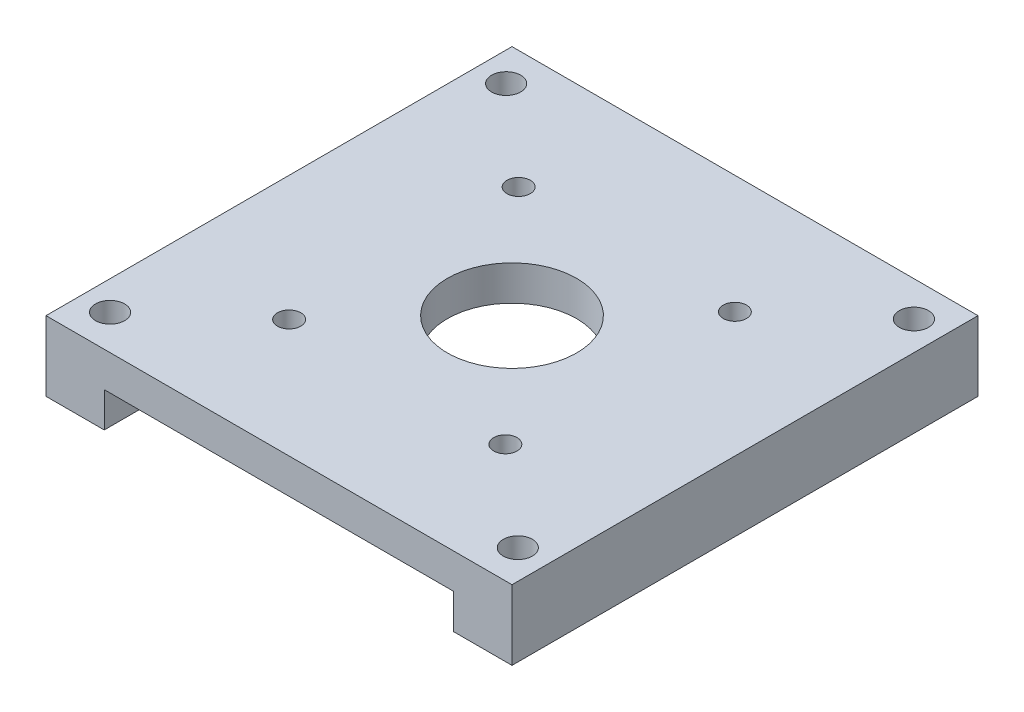
ISO-10303-21;
HEADER;
FILE_DESCRIPTION(('STEP AP214'),'2;1');
FILE_NAME('part.step','',(''),(''),'','','');
FILE_SCHEMA(('AUTOMOTIVE_DESIGN { 1 0 10303 214 1 1 1 1 }'));
ENDSEC;
DATA;
#1=APPLICATION_CONTEXT('core data for automotive mechanical design processes');
#2=APPLICATION_PROTOCOL_DEFINITION('international standard','automotive_design',2000,#1);
#3=PRODUCT_CONTEXT('',#1,'mechanical');
#4=PRODUCT('Part','Part','',(#3));
#5=PRODUCT_RELATED_PRODUCT_CATEGORY('part','',(#4));
#6=PRODUCT_DEFINITION_FORMATION('','',#4);
#7=PRODUCT_DEFINITION_CONTEXT('part definition',#1,'design');
#8=PRODUCT_DEFINITION('design','',#6,#7);
#9=PRODUCT_DEFINITION_SHAPE('','',#8);
#10=(LENGTH_UNIT() NAMED_UNIT(*) SI_UNIT(.MILLI.,.METRE.));
#11=(NAMED_UNIT(*) PLANE_ANGLE_UNIT() SI_UNIT($,.RADIAN.));
#12=(NAMED_UNIT(*) SI_UNIT($,.STERADIAN.) SOLID_ANGLE_UNIT());
#13=UNCERTAINTY_MEASURE_WITH_UNIT(LENGTH_MEASURE(1.E-05),#10,'distance_accuracy_value','');
#14=(GEOMETRIC_REPRESENTATION_CONTEXT(3) GLOBAL_UNCERTAINTY_ASSIGNED_CONTEXT((#13)) GLOBAL_UNIT_ASSIGNED_CONTEXT((#10,
#11,#12)) REPRESENTATION_CONTEXT('',''));
#15=CARTESIAN_POINT('',(0.,0.,0.));
#16=DIRECTION('',(0.,0.,1.));
#17=DIRECTION('',(1.,0.,0.));
#18=AXIS2_PLACEMENT_3D('',#15,#16,#17);
#19=CARTESIAN_POINT('',(0.,0.,0.));
#20=DIRECTION('',(0.,1.,0.));
#21=DIRECTION('',(0.,0.,1.));
#22=AXIS2_PLACEMENT_3D('',#19,#20,#21);
#23=PLANE('',#22);
#24=CARTESIAN_POINT('',(74.3712000000001,0.,-75.819));
#25=DIRECTION('',(0.,1.,0.));
#26=DIRECTION('',(0.,0.,1.));
#27=AXIS2_PLACEMENT_3D('',#24,#25,#26);
#28=CIRCLE('',#27,2.53999999999999);
#29=CARTESIAN_POINT('',(74.3712000000001,0.,-78.359));
#30=VERTEX_POINT('',#29);
#31=EDGE_CURVE('E164',#30,#30,#28,.T.);
#32=ORIENTED_EDGE('',*,*,#31,.T.);
#33=EDGE_LOOP('',(#32));
#34=FACE_BOUND('',#33,.T.);
#35=CARTESIAN_POINT('',(74.3712000000001,0.,-25.7810000000001));
#36=DIRECTION('',(0.,1.,0.));
#37=DIRECTION('',(0.,0.,1.));
#38=AXIS2_PLACEMENT_3D('',#35,#36,#37);
#39=CIRCLE('',#38,2.54);
#40=CARTESIAN_POINT('',(74.3712000000001,0.,-28.3210000000001));
#41=VERTEX_POINT('',#40);
#42=EDGE_CURVE('E198',#41,#41,#39,.T.);
#43=ORIENTED_EDGE('',*,*,#42,.T.);
#44=EDGE_LOOP('',(#43));
#45=FACE_BOUND('',#44,.T.);
#46=CARTESIAN_POINT('',(27.2288000000001,0.,-75.819));
#47=DIRECTION('',(0.,1.,0.));
#48=DIRECTION('',(0.,0.,1.));
#49=AXIS2_PLACEMENT_3D('',#46,#47,#48);
#50=CIRCLE('',#49,2.54);
#51=CARTESIAN_POINT('',(27.2288000000001,0.,-78.359));
#52=VERTEX_POINT('',#51);
#53=EDGE_CURVE('E195',#52,#52,#50,.T.);
#54=ORIENTED_EDGE('',*,*,#53,.T.);
#55=EDGE_LOOP('',(#54));
#56=FACE_BOUND('',#55,.T.);
#57=CARTESIAN_POINT('',(27.2288000000001,0.,-25.7810000000001));
#58=DIRECTION('',(0.,1.,0.));
#59=DIRECTION('',(0.,0.,1.));
#60=AXIS2_PLACEMENT_3D('',#57,#58,#59);
#61=CIRCLE('',#60,2.54);
#62=CARTESIAN_POINT('',(27.2288000000001,0.,-28.3210000000001));
#63=VERTEX_POINT('',#62);
#64=EDGE_CURVE('E192',#63,#63,#61,.T.);
#65=ORIENTED_EDGE('',*,*,#64,.T.);
#66=EDGE_LOOP('',(#65));
#67=FACE_BOUND('',#66,.T.);
#68=CARTESIAN_POINT('',(50.8,0.,-50.8000000000002));
#69=DIRECTION('',(0.,1.,0.));
#70=DIRECTION('',(0.,0.,1.));
#71=AXIS2_PLACEMENT_3D('',#68,#69,#70);
#72=CIRCLE('',#71,14.097);
#73=CARTESIAN_POINT('',(50.8,0.,-64.8970000000002));
#74=VERTEX_POINT('',#73);
#75=EDGE_CURVE('E189',#74,#74,#72,.T.);
#76=ORIENTED_EDGE('',*,*,#75,.T.);
#77=EDGE_LOOP('',(#76));
#78=FACE_BOUND('',#77,.T.);
#79=DIRECTION('',(1.,0.,0.));
#80=VECTOR('',#79,1.);
#81=CARTESIAN_POINT('',(0.,0.,-101.6));
#82=LINE('',#81,#80);
#83=CARTESIAN_POINT('',(12.7,0.,-101.6));
#84=VERTEX_POINT('',#83);
#85=CARTESIAN_POINT('',(88.9,0.,-101.6));
#86=VERTEX_POINT('',#85);
#87=EDGE_CURVE('E67',#84,#86,#82,.T.);
#88=ORIENTED_EDGE('',*,*,#87,.T.);
#89=DIRECTION('',(0.,0.,1.));
#90=VECTOR('',#89,1.);
#91=CARTESIAN_POINT('',(88.9,0.,0.));
#92=LINE('',#91,#90);
#93=CARTESIAN_POINT('',(88.9,0.,0.));
#94=VERTEX_POINT('',#93);
#95=EDGE_CURVE('E62',#86,#94,#92,.T.);
#96=ORIENTED_EDGE('',*,*,#95,.T.);
#97=DIRECTION('',(1.,0.,0.));
#98=VECTOR('',#97,1.);
#99=CARTESIAN_POINT('',(0.,0.,0.));
#100=LINE('',#99,#98);
#101=CARTESIAN_POINT('',(12.7,0.,0.));
#102=VERTEX_POINT('',#101);
#103=EDGE_CURVE('E157',#102,#94,#100,.T.);
#104=ORIENTED_EDGE('',*,*,#103,.F.);
#105=DIRECTION('',(0.,0.,1.));
#106=VECTOR('',#105,1.);
#107=CARTESIAN_POINT('',(12.7,0.,0.));
#108=LINE('',#107,#106);
#109=EDGE_CURVE('E139',#84,#102,#108,.T.);
#110=ORIENTED_EDGE('',*,*,#109,.F.);
#111=EDGE_LOOP('',(#88,#96,#104,#110));
#112=FACE_BOUND('',#111,.T.);
#113=ADVANCED_FACE('F47',(#34,#45,#56,#67,#78,#112),#23,.F.);
#114=CARTESIAN_POINT('',(0.,7.62,0.));
#115=DIRECTION('',(0.,0.,-1.));
#116=DIRECTION('',(-1.,0.,0.));
#117=AXIS2_PLACEMENT_3D('',#114,#115,#116);
#118=PLANE('',#117);
#119=DIRECTION('',(0.,-1.,0.));
#120=VECTOR('',#119,1.);
#121=CARTESIAN_POINT('',(0.,7.62,0.));
#122=LINE('',#121,#120);
#123=CARTESIAN_POINT('',(0.,7.62,0.));
#124=VERTEX_POINT('',#123);
#125=CARTESIAN_POINT('',(0.,-7.62,0.));
#126=VERTEX_POINT('',#125);
#127=EDGE_CURVE('E186',#124,#126,#122,.T.);
#128=ORIENTED_EDGE('',*,*,#127,.T.);
#129=DIRECTION('',(1.,0.,0.));
#130=VECTOR('',#129,1.);
#131=CARTESIAN_POINT('',(0.,-7.62,0.));
#132=LINE('',#131,#130);
#133=CARTESIAN_POINT('',(12.7,-7.62,0.));
#134=VERTEX_POINT('',#133);
#135=EDGE_CURVE('E148',#126,#134,#132,.T.);
#136=ORIENTED_EDGE('',*,*,#135,.T.);
#137=DIRECTION('',(0.,1.,0.));
#138=VECTOR('',#137,1.);
#139=CARTESIAN_POINT('',(12.7,-7.62,0.));
#140=LINE('',#139,#138);
#141=EDGE_CURVE('E154',#134,#102,#140,.T.);
#142=ORIENTED_EDGE('',*,*,#141,.T.);
#143=ORIENTED_EDGE('',*,*,#103,.T.);
#144=DIRECTION('',(0.,1.,0.));
#145=VECTOR('',#144,1.);
#146=CARTESIAN_POINT('',(88.9,-7.62,0.));
#147=LINE('',#146,#145);
#148=CARTESIAN_POINT('',(88.9,-7.62,0.));
#149=VERTEX_POINT('',#148);
#150=EDGE_CURVE('E116',#149,#94,#147,.T.);
#151=ORIENTED_EDGE('',*,*,#150,.F.);
#152=DIRECTION('',(1.,0.,0.));
#153=VECTOR('',#152,1.);
#154=CARTESIAN_POINT('',(0.,-7.62,0.));
#155=LINE('',#154,#153);
#156=CARTESIAN_POINT('',(101.6,-7.62,0.));
#157=VERTEX_POINT('',#156);
#158=EDGE_CURVE('E131',#149,#157,#155,.T.);
#159=ORIENTED_EDGE('',*,*,#158,.T.);
#160=DIRECTION('',(0.,-1.,0.));
#161=VECTOR('',#160,1.);
#162=CARTESIAN_POINT('',(101.6,7.62,0.));
#163=LINE('',#162,#161);
#164=CARTESIAN_POINT('',(101.6,7.62,0.));
#165=VERTEX_POINT('',#164);
#166=EDGE_CURVE('E11',#165,#157,#163,.T.);
#167=ORIENTED_EDGE('',*,*,#166,.F.);
#168=DIRECTION('',(1.,0.,0.));
#169=VECTOR('',#168,1.);
#170=CARTESIAN_POINT('',(0.,7.62,0.));
#171=LINE('',#170,#169);
#172=EDGE_CURVE('E160',#124,#165,#171,.T.);
#173=ORIENTED_EDGE('',*,*,#172,.F.);
#174=EDGE_LOOP('',(#128,#136,#142,#143,#151,#159,#167,#173));
#175=FACE_BOUND('',#174,.T.);
#176=ADVANCED_FACE('F49',(#175),#118,.F.);
#177=CARTESIAN_POINT('',(101.6,7.62,0.));
#178=DIRECTION('',(-1.,0.,0.));
#179=DIRECTION('',(0.,0.,1.));
#180=AXIS2_PLACEMENT_3D('',#177,#178,#179);
#181=PLANE('',#180);
#182=ORIENTED_EDGE('',*,*,#166,.T.);
#183=DIRECTION('',(0.,0.,-1.));
#184=VECTOR('',#183,1.);
#185=CARTESIAN_POINT('',(101.6,-7.62,0.));
#186=LINE('',#185,#184);
#187=CARTESIAN_POINT('',(101.6,-7.62,-101.6));
#188=VERTEX_POINT('',#187);
#189=EDGE_CURVE('E117',#157,#188,#186,.T.);
#190=ORIENTED_EDGE('',*,*,#189,.T.);
#191=DIRECTION('',(0.,-1.,0.));
#192=VECTOR('',#191,1.);
#193=CARTESIAN_POINT('',(101.6,7.62,-101.6));
#194=LINE('',#193,#192);
#195=CARTESIAN_POINT('',(101.6,7.62,-101.6));
#196=VERTEX_POINT('',#195);
#197=EDGE_CURVE('E55',#196,#188,#194,.T.);
#198=ORIENTED_EDGE('',*,*,#197,.F.);
#199=DIRECTION('',(0.,0.,-1.));
#200=VECTOR('',#199,1.);
#201=CARTESIAN_POINT('',(101.6,7.62,0.));
#202=LINE('',#201,#200);
#203=EDGE_CURVE('E163',#165,#196,#202,.T.);
#204=ORIENTED_EDGE('',*,*,#203,.F.);
#205=EDGE_LOOP('',(#182,#190,#198,#204));
#206=FACE_BOUND('',#205,.T.);
#207=ADVANCED_FACE('F226',(#206),#181,.F.);
#208=CARTESIAN_POINT('',(0.,7.62,-101.6));
#209=DIRECTION('',(0.,0.,-1.));
#210=DIRECTION('',(-1.,0.,0.));
#211=AXIS2_PLACEMENT_3D('',#208,#209,#210);
#212=PLANE('',#211);
#213=ORIENTED_EDGE('',*,*,#87,.F.);
#214=DIRECTION('',(0.,1.,0.));
#215=VECTOR('',#214,1.);
#216=CARTESIAN_POINT('',(12.7,-7.62,-101.6));
#217=LINE('',#216,#215);
#218=CARTESIAN_POINT('',(12.7,-7.62,-101.6));
#219=VERTEX_POINT('',#218);
#220=EDGE_CURVE('E151',#219,#84,#217,.T.);
#221=ORIENTED_EDGE('',*,*,#220,.F.);
#222=DIRECTION('',(1.,0.,0.));
#223=VECTOR('',#222,1.);
#224=CARTESIAN_POINT('',(0.,-7.62,-101.6));
#225=LINE('',#224,#223);
#226=CARTESIAN_POINT('',(0.,-7.62,-101.6));
#227=VERTEX_POINT('',#226);
#228=EDGE_CURVE('E143',#227,#219,#225,.T.);
#229=ORIENTED_EDGE('',*,*,#228,.F.);
#230=DIRECTION('',(0.,-1.,0.));
#231=VECTOR('',#230,1.);
#232=CARTESIAN_POINT('',(0.,7.62,-101.6));
#233=LINE('',#232,#231);
#234=CARTESIAN_POINT('',(0.,7.62,-101.6));
#235=VERTEX_POINT('',#234);
#236=EDGE_CURVE('E204',#235,#227,#233,.T.);
#237=ORIENTED_EDGE('',*,*,#236,.F.);
#238=DIRECTION('',(1.,0.,0.));
#239=VECTOR('',#238,1.);
#240=CARTESIAN_POINT('',(0.,7.62,-101.6));
#241=LINE('',#240,#239);
#242=EDGE_CURVE('E166',#235,#196,#241,.T.);
#243=ORIENTED_EDGE('',*,*,#242,.T.);
#244=ORIENTED_EDGE('',*,*,#197,.T.);
#245=DIRECTION('',(1.,0.,0.));
#246=VECTOR('',#245,1.);
#247=CARTESIAN_POINT('',(0.,-7.62,-101.6));
#248=LINE('',#247,#246);
#249=CARTESIAN_POINT('',(88.9,-7.62,-101.6));
#250=VERTEX_POINT('',#249);
#251=EDGE_CURVE('E120',#250,#188,#248,.T.);
#252=ORIENTED_EDGE('',*,*,#251,.F.);
#253=DIRECTION('',(0.,1.,0.));
#254=VECTOR('',#253,1.);
#255=CARTESIAN_POINT('',(88.9,-7.62,-101.6));
#256=LINE('',#255,#254);
#257=EDGE_CURVE('E109',#250,#86,#256,.T.);
#258=ORIENTED_EDGE('',*,*,#257,.T.);
#259=EDGE_LOOP('',(#213,#221,#229,#237,#243,#244,#252,#258));
#260=FACE_BOUND('',#259,.T.);
#261=ADVANCED_FACE('F121',(#260),#212,.T.);
#262=CARTESIAN_POINT('',(74.3712000000001,7.62,-25.7810000000001));
#263=DIRECTION('',(0.,-1.,0.));
#264=DIRECTION('',(0.,0.,-1.));
#265=AXIS2_PLACEMENT_3D('',#262,#263,#264);
#266=CYLINDRICAL_SURFACE('',#265,2.54);
#267=CARTESIAN_POINT('',(74.3712000000001,7.62,-25.7810000000001));
#268=DIRECTION('',(0.,1.,0.));
#269=DIRECTION('',(0.,0.,1.));
#270=AXIS2_PLACEMENT_3D('',#267,#268,#269);
#271=CIRCLE('',#270,2.54);
#272=CARTESIAN_POINT('',(74.3712000000001,7.62,-28.3210000000001));
#273=VERTEX_POINT('',#272);
#274=EDGE_CURVE('E180',#273,#273,#271,.T.);
#275=CARTESIAN_POINT('',(74.3712000000001,7.62,-28.3210000000001));
#276=CARTESIAN_POINT('',(74.3712000000001,7.540625,-28.3210000000001));
#277=CARTESIAN_POINT('',(74.3712000000001,7.46125,-28.3210000000001));
#278=CARTESIAN_POINT('',(74.3712000000001,7.3025,-28.3210000000001));
#279=CARTESIAN_POINT('',(74.3712000000001,7.223125,-28.3210000000001));
#280=CARTESIAN_POINT('',(74.3712000000001,7.064375,-28.3210000000001));
#281=CARTESIAN_POINT('',(74.3712000000001,6.985,-28.3210000000001));
#282=CARTESIAN_POINT('',(74.3712000000001,6.82625,-28.3210000000001));
#283=CARTESIAN_POINT('',(74.3712000000001,6.746875,-28.3210000000001));
#284=CARTESIAN_POINT('',(74.3712000000001,6.588125,-28.3210000000001));
#285=CARTESIAN_POINT('',(74.3712000000001,6.50875,-28.3210000000001));
#286=CARTESIAN_POINT('',(74.3712000000001,6.35,-28.3210000000001));
#287=CARTESIAN_POINT('',(74.3712000000001,6.270625,-28.3210000000001));
#288=CARTESIAN_POINT('',(74.3712000000001,6.111875,-28.3210000000001));
#289=CARTESIAN_POINT('',(74.3712000000001,6.0325,-28.3210000000001));
#290=CARTESIAN_POINT('',(74.3712000000001,5.87375,-28.3210000000001));
#291=CARTESIAN_POINT('',(74.3712000000001,5.794375,-28.3210000000001));
#292=CARTESIAN_POINT('',(74.3712000000001,5.635625,-28.3210000000001));
#293=CARTESIAN_POINT('',(74.3712000000001,5.55625,-28.3210000000001));
#294=CARTESIAN_POINT('',(74.3712000000001,5.3975,-28.3210000000001));
#295=CARTESIAN_POINT('',(74.3712000000001,5.318125,-28.3210000000001));
#296=CARTESIAN_POINT('',(74.3712000000001,5.159375,-28.3210000000001));
#297=CARTESIAN_POINT('',(74.3712000000001,5.08,-28.3210000000001));
#298=CARTESIAN_POINT('',(74.3712000000001,4.92125,-28.3210000000001));
#299=CARTESIAN_POINT('',(74.3712000000001,4.841875,-28.3210000000001));
#300=CARTESIAN_POINT('',(74.3712000000001,4.683125,-28.3210000000001));
#301=CARTESIAN_POINT('',(74.3712000000001,4.60375,-28.3210000000001));
#302=CARTESIAN_POINT('',(74.3712000000001,4.445,-28.3210000000001));
#303=CARTESIAN_POINT('',(74.3712000000001,4.365625,-28.3210000000001));
#304=CARTESIAN_POINT('',(74.3712000000001,4.206875,-28.3210000000001));
#305=CARTESIAN_POINT('',(74.3712000000001,4.1275,-28.3210000000001));
#306=CARTESIAN_POINT('',(74.3712000000001,3.96875,-28.3210000000001));
#307=CARTESIAN_POINT('',(74.3712000000001,3.889375,-28.3210000000001));
#308=CARTESIAN_POINT('',(74.3712000000001,3.730625,-28.3210000000001));
#309=CARTESIAN_POINT('',(74.3712000000001,3.65125,-28.3210000000001));
#310=CARTESIAN_POINT('',(74.3712000000001,3.4925,-28.3210000000001));
#311=CARTESIAN_POINT('',(74.3712000000001,3.413125,-28.3210000000001));
#312=CARTESIAN_POINT('',(74.3712000000001,3.254375,-28.3210000000001));
#313=CARTESIAN_POINT('',(74.3712000000001,3.175,-28.3210000000001));
#314=CARTESIAN_POINT('',(74.3712000000001,3.01625,-28.3210000000001));
#315=CARTESIAN_POINT('',(74.3712000000001,2.936875,-28.3210000000001));
#316=CARTESIAN_POINT('',(74.3712000000001,2.778125,-28.3210000000001));
#317=CARTESIAN_POINT('',(74.3712000000001,2.69875,-28.3210000000001));
#318=CARTESIAN_POINT('',(74.3712000000001,2.54,-28.3210000000001));
#319=CARTESIAN_POINT('',(74.3712000000001,2.460625,-28.3210000000001));
#320=CARTESIAN_POINT('',(74.3712000000001,2.301875,-28.3210000000001));
#321=CARTESIAN_POINT('',(74.3712000000001,2.2225,-28.3210000000001));
#322=CARTESIAN_POINT('',(74.3712000000001,2.06375,-28.3210000000001));
#323=CARTESIAN_POINT('',(74.3712000000001,1.984375,-28.3210000000001));
#324=CARTESIAN_POINT('',(74.3712000000001,1.825625,-28.3210000000001));
#325=CARTESIAN_POINT('',(74.3712000000001,1.74625,-28.3210000000001));
#326=CARTESIAN_POINT('',(74.3712000000001,1.5875,-28.3210000000001));
#327=CARTESIAN_POINT('',(74.3712000000001,1.508125,-28.3210000000001));
#328=CARTESIAN_POINT('',(74.3712000000001,1.349375,-28.3210000000001));
#329=CARTESIAN_POINT('',(74.3712000000001,1.27,-28.3210000000001));
#330=CARTESIAN_POINT('',(74.3712000000001,1.11125,-28.3210000000001));
#331=CARTESIAN_POINT('',(74.3712000000001,1.031875,-28.3210000000001));
#332=CARTESIAN_POINT('',(74.3712000000001,0.873125,-28.3210000000001));
#333=CARTESIAN_POINT('',(74.3712000000001,0.79375,-28.3210000000001));
#334=CARTESIAN_POINT('',(74.3712000000001,0.635,-28.3210000000001));
#335=CARTESIAN_POINT('',(74.3712000000001,0.555625,-28.3210000000001));
#336=CARTESIAN_POINT('',(74.3712000000001,0.396875,-28.3210000000001));
#337=CARTESIAN_POINT('',(74.3712000000001,0.3175,-28.3210000000001));
#338=CARTESIAN_POINT('',(74.3712000000001,0.15875,-28.3210000000001));
#339=CARTESIAN_POINT('',(74.3712000000001,0.0793749999999999,-28.3210000000001));
#340=CARTESIAN_POINT('',(74.3712000000001,0.,-28.3210000000001));
#341=B_SPLINE_CURVE_WITH_KNOTS('',3,(#275,#276,#277,#278,#279,#280,#281,#282,#283,#284,#285,
#286,#287,#288,#289,#290,#291,#292,#293,#294,#295,#296,#297,#298,#299,#300,#301,#302,#303,#304,
#305,#306,#307,#308,#309,#310,#311,#312,#313,#314,#315,#316,#317,#318,#319,#320,#321,#322,#323,
#324,#325,#326,#327,#328,#329,#330,#331,#332,#333,#334,#335,#336,#337,#338,#339,#340),
.UNSPECIFIED.,.F.,.F.,(4,2,2,2,2,2,2,2,2,2,2,2,2,2,2,2,2,2,2,2,2,2,2,2,2,2,2,2,2,2,2,2,4),(0.,
0.238125,0.47625,0.714375000000001,0.9525,1.190625,1.42875,1.666875,1.905,2.143125,2.38125,
2.619375,2.8575,3.095625,3.33375,3.571875,3.81,4.048125,4.28625,4.524375,4.7625,5.000625,
5.23875,5.476875,5.715,5.953125,6.19125,6.429375,6.6675,6.905625,7.14375,7.381875,7.62),.UNSPECIFIED.);
#342=EDGE_CURVE('BSEAM241',#273,#41,#341,.T.);
#343=ORIENTED_EDGE('',*,*,#274,.T.);
#344=ORIENTED_EDGE('',*,*,#42,.F.);
#345=ORIENTED_EDGE('',*,*,#342,.T.);
#346=ORIENTED_EDGE('',*,*,#342,.F.);
#347=EDGE_LOOP('',(#343,#345,#344,#346));
#348=FACE_BOUND('',#347,.T.);
#349=ADVANCED_FACE('F241',(#348),#266,.F.);
#350=CARTESIAN_POINT('',(27.2288000000001,7.62,-75.819));
#351=DIRECTION('',(0.,-1.,0.));
#352=DIRECTION('',(0.,0.,-1.));
#353=AXIS2_PLACEMENT_3D('',#350,#351,#352);
#354=CYLINDRICAL_SURFACE('',#353,2.54);
#355=CARTESIAN_POINT('',(27.2288000000001,7.62,-75.819));
#356=DIRECTION('',(0.,1.,0.));
#357=DIRECTION('',(0.,0.,1.));
#358=AXIS2_PLACEMENT_3D('',#355,#356,#357);
#359=CIRCLE('',#358,2.54);
#360=CARTESIAN_POINT('',(27.2288000000001,7.62,-78.359));
#361=VERTEX_POINT('',#360);
#362=EDGE_CURVE('E177',#361,#361,#359,.T.);
#363=CARTESIAN_POINT('',(27.2288000000001,7.62,-78.359));
#364=CARTESIAN_POINT('',(27.2288000000001,7.540625,-78.359));
#365=CARTESIAN_POINT('',(27.2288000000001,7.46125,-78.359));
#366=CARTESIAN_POINT('',(27.2288000000001,7.3025,-78.359));
#367=CARTESIAN_POINT('',(27.2288000000001,7.223125,-78.359));
#368=CARTESIAN_POINT('',(27.2288000000001,7.064375,-78.359));
#369=CARTESIAN_POINT('',(27.2288000000001,6.985,-78.359));
#370=CARTESIAN_POINT('',(27.2288000000001,6.82625,-78.359));
#371=CARTESIAN_POINT('',(27.2288000000001,6.746875,-78.359));
#372=CARTESIAN_POINT('',(27.2288000000001,6.588125,-78.359));
#373=CARTESIAN_POINT('',(27.2288000000001,6.50875,-78.359));
#374=CARTESIAN_POINT('',(27.2288000000001,6.35,-78.359));
#375=CARTESIAN_POINT('',(27.2288000000001,6.270625,-78.359));
#376=CARTESIAN_POINT('',(27.2288000000001,6.111875,-78.359));
#377=CARTESIAN_POINT('',(27.2288000000001,6.0325,-78.359));
#378=CARTESIAN_POINT('',(27.2288000000001,5.87375,-78.359));
#379=CARTESIAN_POINT('',(27.2288000000001,5.794375,-78.359));
#380=CARTESIAN_POINT('',(27.2288000000001,5.635625,-78.359));
#381=CARTESIAN_POINT('',(27.2288000000001,5.55625,-78.359));
#382=CARTESIAN_POINT('',(27.2288000000001,5.3975,-78.359));
#383=CARTESIAN_POINT('',(27.2288000000001,5.318125,-78.359));
#384=CARTESIAN_POINT('',(27.2288000000001,5.159375,-78.359));
#385=CARTESIAN_POINT('',(27.2288000000001,5.08,-78.359));
#386=CARTESIAN_POINT('',(27.2288000000001,4.92125,-78.359));
#387=CARTESIAN_POINT('',(27.2288000000001,4.841875,-78.359));
#388=CARTESIAN_POINT('',(27.2288000000001,4.683125,-78.359));
#389=CARTESIAN_POINT('',(27.2288000000001,4.60375,-78.359));
#390=CARTESIAN_POINT('',(27.2288000000001,4.445,-78.359));
#391=CARTESIAN_POINT('',(27.2288000000001,4.365625,-78.359));
#392=CARTESIAN_POINT('',(27.2288000000001,4.206875,-78.359));
#393=CARTESIAN_POINT('',(27.2288000000001,4.1275,-78.359));
#394=CARTESIAN_POINT('',(27.2288000000001,3.96875,-78.359));
#395=CARTESIAN_POINT('',(27.2288000000001,3.889375,-78.359));
#396=CARTESIAN_POINT('',(27.2288000000001,3.730625,-78.359));
#397=CARTESIAN_POINT('',(27.2288000000001,3.65125,-78.359));
#398=CARTESIAN_POINT('',(27.2288000000001,3.4925,-78.359));
#399=CARTESIAN_POINT('',(27.2288000000001,3.413125,-78.359));
#400=CARTESIAN_POINT('',(27.2288000000001,3.254375,-78.359));
#401=CARTESIAN_POINT('',(27.2288000000001,3.175,-78.359));
#402=CARTESIAN_POINT('',(27.2288000000001,3.01625,-78.359));
#403=CARTESIAN_POINT('',(27.2288000000001,2.936875,-78.359));
#404=CARTESIAN_POINT('',(27.2288000000001,2.778125,-78.359));
#405=CARTESIAN_POINT('',(27.2288000000001,2.69875,-78.359));
#406=CARTESIAN_POINT('',(27.2288000000001,2.54,-78.359));
#407=CARTESIAN_POINT('',(27.2288000000001,2.460625,-78.359));
#408=CARTESIAN_POINT('',(27.2288000000001,2.301875,-78.359));
#409=CARTESIAN_POINT('',(27.2288000000001,2.2225,-78.359));
#410=CARTESIAN_POINT('',(27.2288000000001,2.06375,-78.359));
#411=CARTESIAN_POINT('',(27.2288000000001,1.984375,-78.359));
#412=CARTESIAN_POINT('',(27.2288000000001,1.825625,-78.359));
#413=CARTESIAN_POINT('',(27.2288000000001,1.74625,-78.359));
#414=CARTESIAN_POINT('',(27.2288000000001,1.5875,-78.359));
#415=CARTESIAN_POINT('',(27.2288000000001,1.508125,-78.359));
#416=CARTESIAN_POINT('',(27.2288000000001,1.349375,-78.359));
#417=CARTESIAN_POINT('',(27.2288000000001,1.27,-78.359));
#418=CARTESIAN_POINT('',(27.2288000000001,1.11125,-78.359));
#419=CARTESIAN_POINT('',(27.2288000000001,1.031875,-78.359));
#420=CARTESIAN_POINT('',(27.2288000000001,0.873125,-78.359));
#421=CARTESIAN_POINT('',(27.2288000000001,0.79375,-78.359));
#422=CARTESIAN_POINT('',(27.2288000000001,0.635,-78.359));
#423=CARTESIAN_POINT('',(27.2288000000001,0.555625,-78.359));
#424=CARTESIAN_POINT('',(27.2288000000001,0.396875,-78.359));
#425=CARTESIAN_POINT('',(27.2288000000001,0.3175,-78.359));
#426=CARTESIAN_POINT('',(27.2288000000001,0.15875,-78.359));
#427=CARTESIAN_POINT('',(27.2288000000001,0.0793749999999999,-78.359));
#428=CARTESIAN_POINT('',(27.2288000000001,0.,-78.359));
#429=B_SPLINE_CURVE_WITH_KNOTS('',3,(#363,#364,#365,#366,#367,#368,#369,#370,#371,#372,#373,
#374,#375,#376,#377,#378,#379,#380,#381,#382,#383,#384,#385,#386,#387,#388,#389,#390,#391,#392,
#393,#394,#395,#396,#397,#398,#399,#400,#401,#402,#403,#404,#405,#406,#407,#408,#409,#410,#411,
#412,#413,#414,#415,#416,#417,#418,#419,#420,#421,#422,#423,#424,#425,#426,#427,#428),
.UNSPECIFIED.,.F.,.F.,(4,2,2,2,2,2,2,2,2,2,2,2,2,2,2,2,2,2,2,2,2,2,2,2,2,2,2,2,2,2,2,2,4),(0.,
0.238125,0.47625,0.714375000000001,0.9525,1.190625,1.42875,1.666875,1.905,2.143125,2.38125,
2.619375,2.8575,3.095625,3.33375,3.571875,3.81,4.048125,4.28625,4.524375,4.7625,5.000625,
5.23875,5.476875,5.715,5.953125,6.19125,6.429375,6.6675,6.905625,7.14375,7.381875,7.62),.UNSPECIFIED.);
#430=EDGE_CURVE('BSEAM244',#361,#52,#429,.T.);
#431=ORIENTED_EDGE('',*,*,#362,.T.);
#432=ORIENTED_EDGE('',*,*,#53,.F.);
#433=ORIENTED_EDGE('',*,*,#430,.T.);
#434=ORIENTED_EDGE('',*,*,#430,.F.);
#435=EDGE_LOOP('',(#431,#433,#432,#434));
#436=FACE_BOUND('',#435,.T.);
#437=ADVANCED_FACE('F244',(#436),#354,.F.);
#438=CARTESIAN_POINT('',(27.2288000000001,7.62,-25.7810000000001));
#439=DIRECTION('',(0.,-1.,0.));
#440=DIRECTION('',(0.,0.,-1.));
#441=AXIS2_PLACEMENT_3D('',#438,#439,#440);
#442=CYLINDRICAL_SURFACE('',#441,2.54);
#443=CARTESIAN_POINT('',(27.2288000000001,7.62,-25.7810000000001));
#444=DIRECTION('',(0.,1.,0.));
#445=DIRECTION('',(0.,0.,1.));
#446=AXIS2_PLACEMENT_3D('',#443,#444,#445);
#447=CIRCLE('',#446,2.54);
#448=CARTESIAN_POINT('',(27.2288000000001,7.62,-28.3210000000001));
#449=VERTEX_POINT('',#448);
#450=EDGE_CURVE('E174',#449,#449,#447,.T.);
#451=CARTESIAN_POINT('',(27.2288000000001,7.62,-28.3210000000001));
#452=CARTESIAN_POINT('',(27.2288000000001,7.540625,-28.3210000000001));
#453=CARTESIAN_POINT('',(27.2288000000001,7.46125,-28.3210000000001));
#454=CARTESIAN_POINT('',(27.2288000000001,7.3025,-28.3210000000001));
#455=CARTESIAN_POINT('',(27.2288000000001,7.223125,-28.3210000000001));
#456=CARTESIAN_POINT('',(27.2288000000001,7.064375,-28.3210000000001));
#457=CARTESIAN_POINT('',(27.2288000000001,6.985,-28.3210000000001));
#458=CARTESIAN_POINT('',(27.2288000000001,6.82625,-28.3210000000001));
#459=CARTESIAN_POINT('',(27.2288000000001,6.746875,-28.3210000000001));
#460=CARTESIAN_POINT('',(27.2288000000001,6.588125,-28.3210000000001));
#461=CARTESIAN_POINT('',(27.2288000000001,6.50875,-28.3210000000001));
#462=CARTESIAN_POINT('',(27.2288000000001,6.35,-28.3210000000001));
#463=CARTESIAN_POINT('',(27.2288000000001,6.270625,-28.3210000000001));
#464=CARTESIAN_POINT('',(27.2288000000001,6.111875,-28.3210000000001));
#465=CARTESIAN_POINT('',(27.2288000000001,6.0325,-28.3210000000001));
#466=CARTESIAN_POINT('',(27.2288000000001,5.87375,-28.3210000000001));
#467=CARTESIAN_POINT('',(27.2288000000001,5.794375,-28.3210000000001));
#468=CARTESIAN_POINT('',(27.2288000000001,5.635625,-28.3210000000001));
#469=CARTESIAN_POINT('',(27.2288000000001,5.55625,-28.3210000000001));
#470=CARTESIAN_POINT('',(27.2288000000001,5.3975,-28.3210000000001));
#471=CARTESIAN_POINT('',(27.2288000000001,5.318125,-28.3210000000001));
#472=CARTESIAN_POINT('',(27.2288000000001,5.159375,-28.3210000000001));
#473=CARTESIAN_POINT('',(27.2288000000001,5.08,-28.3210000000001));
#474=CARTESIAN_POINT('',(27.2288000000001,4.92125,-28.3210000000001));
#475=CARTESIAN_POINT('',(27.2288000000001,4.841875,-28.3210000000001));
#476=CARTESIAN_POINT('',(27.2288000000001,4.683125,-28.3210000000001));
#477=CARTESIAN_POINT('',(27.2288000000001,4.60375,-28.3210000000001));
#478=CARTESIAN_POINT('',(27.2288000000001,4.445,-28.3210000000001));
#479=CARTESIAN_POINT('',(27.2288000000001,4.365625,-28.3210000000001));
#480=CARTESIAN_POINT('',(27.2288000000001,4.206875,-28.3210000000001));
#481=CARTESIAN_POINT('',(27.2288000000001,4.1275,-28.3210000000001));
#482=CARTESIAN_POINT('',(27.2288000000001,3.96875,-28.3210000000001));
#483=CARTESIAN_POINT('',(27.2288000000001,3.889375,-28.3210000000001));
#484=CARTESIAN_POINT('',(27.2288000000001,3.730625,-28.3210000000001));
#485=CARTESIAN_POINT('',(27.2288000000001,3.65125,-28.3210000000001));
#486=CARTESIAN_POINT('',(27.2288000000001,3.4925,-28.3210000000001));
#487=CARTESIAN_POINT('',(27.2288000000001,3.413125,-28.3210000000001));
#488=CARTESIAN_POINT('',(27.2288000000001,3.254375,-28.3210000000001));
#489=CARTESIAN_POINT('',(27.2288000000001,3.175,-28.3210000000001));
#490=CARTESIAN_POINT('',(27.2288000000001,3.01625,-28.3210000000001));
#491=CARTESIAN_POINT('',(27.2288000000001,2.936875,-28.3210000000001));
#492=CARTESIAN_POINT('',(27.2288000000001,2.778125,-28.3210000000001));
#493=CARTESIAN_POINT('',(27.2288000000001,2.69875,-28.3210000000001));
#494=CARTESIAN_POINT('',(27.2288000000001,2.54,-28.3210000000001));
#495=CARTESIAN_POINT('',(27.2288000000001,2.460625,-28.3210000000001));
#496=CARTESIAN_POINT('',(27.2288000000001,2.301875,-28.3210000000001));
#497=CARTESIAN_POINT('',(27.2288000000001,2.2225,-28.3210000000001));
#498=CARTESIAN_POINT('',(27.2288000000001,2.06375,-28.3210000000001));
#499=CARTESIAN_POINT('',(27.2288000000001,1.984375,-28.3210000000001));
#500=CARTESIAN_POINT('',(27.2288000000001,1.825625,-28.3210000000001));
#501=CARTESIAN_POINT('',(27.2288000000001,1.74625,-28.3210000000001));
#502=CARTESIAN_POINT('',(27.2288000000001,1.5875,-28.3210000000001));
#503=CARTESIAN_POINT('',(27.2288000000001,1.508125,-28.3210000000001));
#504=CARTESIAN_POINT('',(27.2288000000001,1.349375,-28.3210000000001));
#505=CARTESIAN_POINT('',(27.2288000000001,1.27,-28.3210000000001));
#506=CARTESIAN_POINT('',(27.2288000000001,1.11125,-28.3210000000001));
#507=CARTESIAN_POINT('',(27.2288000000001,1.031875,-28.3210000000001));
#508=CARTESIAN_POINT('',(27.2288000000001,0.873125,-28.3210000000001));
#509=CARTESIAN_POINT('',(27.2288000000001,0.79375,-28.3210000000001));
#510=CARTESIAN_POINT('',(27.2288000000001,0.635,-28.3210000000001));
#511=CARTESIAN_POINT('',(27.2288000000001,0.555625,-28.3210000000001));
#512=CARTESIAN_POINT('',(27.2288000000001,0.396875,-28.3210000000001));
#513=CARTESIAN_POINT('',(27.2288000000001,0.3175,-28.3210000000001));
#514=CARTESIAN_POINT('',(27.2288000000001,0.15875,-28.3210000000001));
#515=CARTESIAN_POINT('',(27.2288000000001,0.0793749999999999,-28.3210000000001));
#516=CARTESIAN_POINT('',(27.2288000000001,0.,-28.3210000000001));
#517=B_SPLINE_CURVE_WITH_KNOTS('',3,(#451,#452,#453,#454,#455,#456,#457,#458,#459,#460,#461,
#462,#463,#464,#465,#466,#467,#468,#469,#470,#471,#472,#473,#474,#475,#476,#477,#478,#479,#480,
#481,#482,#483,#484,#485,#486,#487,#488,#489,#490,#491,#492,#493,#494,#495,#496,#497,#498,#499,
#500,#501,#502,#503,#504,#505,#506,#507,#508,#509,#510,#511,#512,#513,#514,#515,#516),
.UNSPECIFIED.,.F.,.F.,(4,2,2,2,2,2,2,2,2,2,2,2,2,2,2,2,2,2,2,2,2,2,2,2,2,2,2,2,2,2,2,2,4),(0.,
0.238125,0.47625,0.714375000000001,0.9525,1.190625,1.42875,1.666875,1.905,2.143125,2.38125,
2.619375,2.8575,3.095625,3.33375,3.571875,3.81,4.048125,4.28625,4.524375,4.7625,5.000625,
5.23875,5.476875,5.715,5.953125,6.19125,6.429375,6.6675,6.905625,7.14375,7.381875,7.62),.UNSPECIFIED.);
#518=EDGE_CURVE('BSEAM248',#449,#63,#517,.T.);
#519=ORIENTED_EDGE('',*,*,#450,.T.);
#520=ORIENTED_EDGE('',*,*,#64,.F.);
#521=ORIENTED_EDGE('',*,*,#518,.T.);
#522=ORIENTED_EDGE('',*,*,#518,.F.);
#523=EDGE_LOOP('',(#519,#521,#520,#522));
#524=FACE_BOUND('',#523,.T.);
#525=ADVANCED_FACE('F248',(#524),#442,.F.);
#526=CARTESIAN_POINT('',(50.8,7.62,-50.8000000000002));
#527=DIRECTION('',(0.,-1.,0.));
#528=DIRECTION('',(0.,0.,-1.));
#529=AXIS2_PLACEMENT_3D('',#526,#527,#528);
#530=CYLINDRICAL_SURFACE('',#529,14.097);
#531=CARTESIAN_POINT('',(50.8,7.62,-50.8000000000002));
#532=DIRECTION('',(0.,1.,0.));
#533=DIRECTION('',(0.,0.,1.));
#534=AXIS2_PLACEMENT_3D('',#531,#532,#533);
#535=CIRCLE('',#534,14.097);
#536=CARTESIAN_POINT('',(50.8,7.62,-64.8970000000002));
#537=VERTEX_POINT('',#536);
#538=EDGE_CURVE('E171',#537,#537,#535,.T.);
#539=CARTESIAN_POINT('',(50.8,7.62,-64.8970000000002));
#540=CARTESIAN_POINT('',(50.8,7.540625,-64.8970000000002));
#541=CARTESIAN_POINT('',(50.8,7.46125,-64.8970000000002));
#542=CARTESIAN_POINT('',(50.8,7.3025,-64.8970000000002));
#543=CARTESIAN_POINT('',(50.8,7.223125,-64.8970000000002));
#544=CARTESIAN_POINT('',(50.8,7.064375,-64.8970000000002));
#545=CARTESIAN_POINT('',(50.8,6.985,-64.8970000000002));
#546=CARTESIAN_POINT('',(50.8,6.82625,-64.8970000000002));
#547=CARTESIAN_POINT('',(50.8,6.746875,-64.8970000000002));
#548=CARTESIAN_POINT('',(50.8,6.588125,-64.8970000000002));
#549=CARTESIAN_POINT('',(50.8,6.50875,-64.8970000000002));
#550=CARTESIAN_POINT('',(50.8,6.35,-64.8970000000002));
#551=CARTESIAN_POINT('',(50.8,6.270625,-64.8970000000002));
#552=CARTESIAN_POINT('',(50.8,6.111875,-64.8970000000002));
#553=CARTESIAN_POINT('',(50.8,6.0325,-64.8970000000002));
#554=CARTESIAN_POINT('',(50.8,5.87375,-64.8970000000002));
#555=CARTESIAN_POINT('',(50.8,5.794375,-64.8970000000002));
#556=CARTESIAN_POINT('',(50.8,5.635625,-64.8970000000002));
#557=CARTESIAN_POINT('',(50.8,5.55625,-64.8970000000002));
#558=CARTESIAN_POINT('',(50.8,5.3975,-64.8970000000002));
#559=CARTESIAN_POINT('',(50.8,5.318125,-64.8970000000002));
#560=CARTESIAN_POINT('',(50.8,5.159375,-64.8970000000002));
#561=CARTESIAN_POINT('',(50.8,5.08,-64.8970000000002));
#562=CARTESIAN_POINT('',(50.8,4.92125,-64.8970000000002));
#563=CARTESIAN_POINT('',(50.8,4.841875,-64.8970000000002));
#564=CARTESIAN_POINT('',(50.8,4.683125,-64.8970000000002));
#565=CARTESIAN_POINT('',(50.8,4.60375,-64.8970000000002));
#566=CARTESIAN_POINT('',(50.8,4.445,-64.8970000000002));
#567=CARTESIAN_POINT('',(50.8,4.365625,-64.8970000000002));
#568=CARTESIAN_POINT('',(50.8,4.206875,-64.8970000000002));
#569=CARTESIAN_POINT('',(50.8,4.1275,-64.8970000000002));
#570=CARTESIAN_POINT('',(50.8,3.96875,-64.8970000000002));
#571=CARTESIAN_POINT('',(50.8,3.889375,-64.8970000000002));
#572=CARTESIAN_POINT('',(50.8,3.730625,-64.8970000000002));
#573=CARTESIAN_POINT('',(50.8,3.65125,-64.8970000000002));
#574=CARTESIAN_POINT('',(50.8,3.4925,-64.8970000000002));
#575=CARTESIAN_POINT('',(50.8,3.413125,-64.8970000000002));
#576=CARTESIAN_POINT('',(50.8,3.254375,-64.8970000000002));
#577=CARTESIAN_POINT('',(50.8,3.175,-64.8970000000002));
#578=CARTESIAN_POINT('',(50.8,3.01625,-64.8970000000002));
#579=CARTESIAN_POINT('',(50.8,2.936875,-64.8970000000002));
#580=CARTESIAN_POINT('',(50.8,2.778125,-64.8970000000002));
#581=CARTESIAN_POINT('',(50.8,2.69875,-64.8970000000002));
#582=CARTESIAN_POINT('',(50.8,2.54,-64.8970000000002));
#583=CARTESIAN_POINT('',(50.8,2.460625,-64.8970000000002));
#584=CARTESIAN_POINT('',(50.8,2.301875,-64.8970000000002));
#585=CARTESIAN_POINT('',(50.8,2.2225,-64.8970000000002));
#586=CARTESIAN_POINT('',(50.8,2.06375,-64.8970000000002));
#587=CARTESIAN_POINT('',(50.8,1.984375,-64.8970000000002));
#588=CARTESIAN_POINT('',(50.8,1.825625,-64.8970000000002));
#589=CARTESIAN_POINT('',(50.8,1.74625,-64.8970000000002));
#590=CARTESIAN_POINT('',(50.8,1.5875,-64.8970000000002));
#591=CARTESIAN_POINT('',(50.8,1.508125,-64.8970000000002));
#592=CARTESIAN_POINT('',(50.8,1.349375,-64.8970000000002));
#593=CARTESIAN_POINT('',(50.8,1.27,-64.8970000000002));
#594=CARTESIAN_POINT('',(50.8,1.11125,-64.8970000000002));
#595=CARTESIAN_POINT('',(50.8,1.031875,-64.8970000000002));
#596=CARTESIAN_POINT('',(50.8,0.873125,-64.8970000000002));
#597=CARTESIAN_POINT('',(50.8,0.79375,-64.8970000000002));
#598=CARTESIAN_POINT('',(50.8,0.635,-64.8970000000002));
#599=CARTESIAN_POINT('',(50.8,0.555625,-64.8970000000002));
#600=CARTESIAN_POINT('',(50.8,0.396875,-64.8970000000002));
#601=CARTESIAN_POINT('',(50.8,0.3175,-64.8970000000002));
#602=CARTESIAN_POINT('',(50.8,0.15875,-64.8970000000002));
#603=CARTESIAN_POINT('',(50.8,0.0793749999999999,-64.8970000000002));
#604=CARTESIAN_POINT('',(50.8,0.,-64.8970000000002));
#605=B_SPLINE_CURVE_WITH_KNOTS('',3,(#539,#540,#541,#542,#543,#544,#545,#546,#547,#548,#549,
#550,#551,#552,#553,#554,#555,#556,#557,#558,#559,#560,#561,#562,#563,#564,#565,#566,#567,#568,
#569,#570,#571,#572,#573,#574,#575,#576,#577,#578,#579,#580,#581,#582,#583,#584,#585,#586,#587,
#588,#589,#590,#591,#592,#593,#594,#595,#596,#597,#598,#599,#600,#601,#602,#603,#604),
.UNSPECIFIED.,.F.,.F.,(4,2,2,2,2,2,2,2,2,2,2,2,2,2,2,2,2,2,2,2,2,2,2,2,2,2,2,2,2,2,2,2,4),(0.,
0.238125,0.47625,0.714375000000001,0.9525,1.190625,1.42875,1.666875,1.905,2.143125,2.38125,
2.619375,2.8575,3.095625,3.33375,3.571875,3.81,4.048125,4.28625,4.524375,4.7625,5.000625,
5.23875,5.476875,5.715,5.953125,6.19125,6.429375,6.6675,6.905625,7.14375,7.381875,7.62),.UNSPECIFIED.);
#606=EDGE_CURVE('BSEAM252',#537,#74,#605,.T.);
#607=ORIENTED_EDGE('',*,*,#538,.T.);
#608=ORIENTED_EDGE('',*,*,#75,.F.);
#609=ORIENTED_EDGE('',*,*,#606,.T.);
#610=ORIENTED_EDGE('',*,*,#606,.F.);
#611=EDGE_LOOP('',(#607,#609,#608,#610));
#612=FACE_BOUND('',#611,.T.);
#613=ADVANCED_FACE('F252',(#612),#530,.F.);
#614=CARTESIAN_POINT('',(0.,7.62,0.));
#615=DIRECTION('',(-1.,0.,0.));
#616=DIRECTION('',(0.,0.,1.));
#617=AXIS2_PLACEMENT_3D('',#614,#615,#616);
#618=PLANE('',#617);
#619=ORIENTED_EDGE('',*,*,#236,.T.);
#620=DIRECTION('',(0.,0.,-1.));
#621=VECTOR('',#620,1.);
#622=CARTESIAN_POINT('',(0.,-7.62,0.));
#623=LINE('',#622,#621);
#624=EDGE_CURVE('E145',#126,#227,#623,.T.);
#625=ORIENTED_EDGE('',*,*,#624,.F.);
#626=ORIENTED_EDGE('',*,*,#127,.F.);
#627=DIRECTION('',(0.,0.,-1.));
#628=VECTOR('',#627,1.);
#629=CARTESIAN_POINT('',(0.,7.62,0.));
#630=LINE('',#629,#628);
#631=EDGE_CURVE('E168',#124,#235,#630,.T.);
#632=ORIENTED_EDGE('',*,*,#631,.T.);
#633=EDGE_LOOP('',(#619,#625,#626,#632));
#634=FACE_BOUND('',#633,.T.);
#635=ADVANCED_FACE('F207',(#634),#618,.T.);
#636=CARTESIAN_POINT('',(74.3712000000001,7.62,-75.819));
#637=DIRECTION('',(0.,-1.,0.));
#638=DIRECTION('',(0.,0.,-1.));
#639=AXIS2_PLACEMENT_3D('',#636,#637,#638);
#640=CYLINDRICAL_SURFACE('',#639,2.53999999999999);
#641=CARTESIAN_POINT('',(74.3712000000001,7.62,-75.819));
#642=DIRECTION('',(0.,1.,0.));
#643=DIRECTION('',(0.,0.,1.));
#644=AXIS2_PLACEMENT_3D('',#641,#642,#643);
#645=CIRCLE('',#644,2.53999999999999);
#646=CARTESIAN_POINT('',(74.3712000000001,7.62,-78.359));
#647=VERTEX_POINT('',#646);
#648=EDGE_CURVE('E183',#647,#647,#645,.T.);
#649=CARTESIAN_POINT('',(74.3712000000001,7.62,-78.359));
#650=CARTESIAN_POINT('',(74.3712000000001,7.540625,-78.359));
#651=CARTESIAN_POINT('',(74.3712000000001,7.46125,-78.359));
#652=CARTESIAN_POINT('',(74.3712000000001,7.3025,-78.359));
#653=CARTESIAN_POINT('',(74.3712000000001,7.223125,-78.359));
#654=CARTESIAN_POINT('',(74.3712000000001,7.064375,-78.359));
#655=CARTESIAN_POINT('',(74.3712000000001,6.985,-78.359));
#656=CARTESIAN_POINT('',(74.3712000000001,6.82625,-78.359));
#657=CARTESIAN_POINT('',(74.3712000000001,6.746875,-78.359));
#658=CARTESIAN_POINT('',(74.3712000000001,6.588125,-78.359));
#659=CARTESIAN_POINT('',(74.3712000000001,6.50875,-78.359));
#660=CARTESIAN_POINT('',(74.3712000000001,6.35,-78.359));
#661=CARTESIAN_POINT('',(74.3712000000001,6.270625,-78.359));
#662=CARTESIAN_POINT('',(74.3712000000001,6.111875,-78.359));
#663=CARTESIAN_POINT('',(74.3712000000001,6.0325,-78.359));
#664=CARTESIAN_POINT('',(74.3712000000001,5.87375,-78.359));
#665=CARTESIAN_POINT('',(74.3712000000001,5.794375,-78.359));
#666=CARTESIAN_POINT('',(74.3712000000001,5.635625,-78.359));
#667=CARTESIAN_POINT('',(74.3712000000001,5.55625,-78.359));
#668=CARTESIAN_POINT('',(74.3712000000001,5.3975,-78.359));
#669=CARTESIAN_POINT('',(74.3712000000001,5.318125,-78.359));
#670=CARTESIAN_POINT('',(74.3712000000001,5.159375,-78.359));
#671=CARTESIAN_POINT('',(74.3712000000001,5.08,-78.359));
#672=CARTESIAN_POINT('',(74.3712000000001,4.92125,-78.359));
#673=CARTESIAN_POINT('',(74.3712000000001,4.841875,-78.359));
#674=CARTESIAN_POINT('',(74.3712000000001,4.683125,-78.359));
#675=CARTESIAN_POINT('',(74.3712000000001,4.60375,-78.359));
#676=CARTESIAN_POINT('',(74.3712000000001,4.445,-78.359));
#677=CARTESIAN_POINT('',(74.3712000000001,4.365625,-78.359));
#678=CARTESIAN_POINT('',(74.3712000000001,4.206875,-78.359));
#679=CARTESIAN_POINT('',(74.3712000000001,4.1275,-78.359));
#680=CARTESIAN_POINT('',(74.3712000000001,3.96875,-78.359));
#681=CARTESIAN_POINT('',(74.3712000000001,3.889375,-78.359));
#682=CARTESIAN_POINT('',(74.3712000000001,3.730625,-78.359));
#683=CARTESIAN_POINT('',(74.3712000000001,3.65125,-78.359));
#684=CARTESIAN_POINT('',(74.3712000000001,3.4925,-78.359));
#685=CARTESIAN_POINT('',(74.3712000000001,3.413125,-78.359));
#686=CARTESIAN_POINT('',(74.3712000000001,3.254375,-78.359));
#687=CARTESIAN_POINT('',(74.3712000000001,3.175,-78.359));
#688=CARTESIAN_POINT('',(74.3712000000001,3.01625,-78.359));
#689=CARTESIAN_POINT('',(74.3712000000001,2.936875,-78.359));
#690=CARTESIAN_POINT('',(74.3712000000001,2.778125,-78.359));
#691=CARTESIAN_POINT('',(74.3712000000001,2.69875,-78.359));
#692=CARTESIAN_POINT('',(74.3712000000001,2.54,-78.359));
#693=CARTESIAN_POINT('',(74.3712000000001,2.460625,-78.359));
#694=CARTESIAN_POINT('',(74.3712000000001,2.301875,-78.359));
#695=CARTESIAN_POINT('',(74.3712000000001,2.2225,-78.359));
#696=CARTESIAN_POINT('',(74.3712000000001,2.06375,-78.359));
#697=CARTESIAN_POINT('',(74.3712000000001,1.984375,-78.359));
#698=CARTESIAN_POINT('',(74.3712000000001,1.825625,-78.359));
#699=CARTESIAN_POINT('',(74.3712000000001,1.74625,-78.359));
#700=CARTESIAN_POINT('',(74.3712000000001,1.5875,-78.359));
#701=CARTESIAN_POINT('',(74.3712000000001,1.508125,-78.359));
#702=CARTESIAN_POINT('',(74.3712000000001,1.349375,-78.359));
#703=CARTESIAN_POINT('',(74.3712000000001,1.27,-78.359));
#704=CARTESIAN_POINT('',(74.3712000000001,1.11125,-78.359));
#705=CARTESIAN_POINT('',(74.3712000000001,1.031875,-78.359));
#706=CARTESIAN_POINT('',(74.3712000000001,0.873125,-78.359));
#707=CARTESIAN_POINT('',(74.3712000000001,0.79375,-78.359));
#708=CARTESIAN_POINT('',(74.3712000000001,0.635,-78.359));
#709=CARTESIAN_POINT('',(74.3712000000001,0.555625,-78.359));
#710=CARTESIAN_POINT('',(74.3712000000001,0.396875,-78.359));
#711=CARTESIAN_POINT('',(74.3712000000001,0.3175,-78.359));
#712=CARTESIAN_POINT('',(74.3712000000001,0.15875,-78.359));
#713=CARTESIAN_POINT('',(74.3712000000001,0.0793749999999999,-78.359));
#714=CARTESIAN_POINT('',(74.3712000000001,0.,-78.359));
#715=B_SPLINE_CURVE_WITH_KNOTS('',3,(#649,#650,#651,#652,#653,#654,#655,#656,#657,#658,#659,
#660,#661,#662,#663,#664,#665,#666,#667,#668,#669,#670,#671,#672,#673,#674,#675,#676,#677,#678,
#679,#680,#681,#682,#683,#684,#685,#686,#687,#688,#689,#690,#691,#692,#693,#694,#695,#696,#697,
#698,#699,#700,#701,#702,#703,#704,#705,#706,#707,#708,#709,#710,#711,#712,#713,#714),
.UNSPECIFIED.,.F.,.F.,(4,2,2,2,2,2,2,2,2,2,2,2,2,2,2,2,2,2,2,2,2,2,2,2,2,2,2,2,2,2,2,2,4),(0.,
0.238125,0.47625,0.714375000000001,0.9525,1.190625,1.42875,1.666875,1.905,2.143125,2.38125,
2.619375,2.8575,3.095625,3.33375,3.571875,3.81,4.048125,4.28625,4.524375,4.7625,5.000625,
5.23875,5.476875,5.715,5.953125,6.19125,6.429375,6.6675,6.905625,7.14375,7.381875,7.62),.UNSPECIFIED.);
#716=EDGE_CURVE('BSEAM237',#647,#30,#715,.T.);
#717=ORIENTED_EDGE('',*,*,#648,.T.);
#718=ORIENTED_EDGE('',*,*,#31,.F.);
#719=ORIENTED_EDGE('',*,*,#716,.T.);
#720=ORIENTED_EDGE('',*,*,#716,.F.);
#721=EDGE_LOOP('',(#717,#719,#718,#720));
#722=FACE_BOUND('',#721,.T.);
#723=ADVANCED_FACE('F237',(#722),#640,.F.);
#724=CARTESIAN_POINT('',(0.,7.62,0.));
#725=DIRECTION('',(0.,1.,0.));
#726=DIRECTION('',(0.,0.,1.));
#727=AXIS2_PLACEMENT_3D('',#724,#725,#726);
#728=PLANE('',#727);
#729=CARTESIAN_POINT('',(6.35,7.62,-93.98));
#730=DIRECTION('',(0.,1.,0.));
#731=DIRECTION('',(0.,0.,1.));
#732=AXIS2_PLACEMENT_3D('',#729,#730,#731);
#733=CIRCLE('',#732,3.175);
#734=CARTESIAN_POINT('',(6.35,7.62,-90.805));
#735=VERTEX_POINT('',#734);
#736=EDGE_CURVE('E138',#735,#735,#733,.T.);
#737=ORIENTED_EDGE('',*,*,#736,.F.);
#738=EDGE_LOOP('',(#737));
#739=FACE_BOUND('',#738,.T.);
#740=CARTESIAN_POINT('',(6.35,7.62,-7.62));
#741=DIRECTION('',(0.,1.,0.));
#742=DIRECTION('',(0.,0.,1.));
#743=AXIS2_PLACEMENT_3D('',#740,#741,#742);
#744=CIRCLE('',#743,3.175);
#745=CARTESIAN_POINT('',(6.35,7.62,-4.445));
#746=VERTEX_POINT('',#745);
#747=EDGE_CURVE('E519',#746,#746,#744,.T.);
#748=ORIENTED_EDGE('',*,*,#747,.F.);
#749=EDGE_LOOP('',(#748));
#750=FACE_BOUND('',#749,.T.);
#751=CARTESIAN_POINT('',(95.25,7.62,-7.62));
#752=DIRECTION('',(0.,1.,0.));
#753=DIRECTION('',(0.,0.,1.));
#754=AXIS2_PLACEMENT_3D('',#751,#752,#753);
#755=CIRCLE('',#754,3.175);
#756=CARTESIAN_POINT('',(95.25,7.62,-4.445));
#757=VERTEX_POINT('',#756);
#758=EDGE_CURVE('E523',#757,#757,#755,.T.);
#759=ORIENTED_EDGE('',*,*,#758,.F.);
#760=EDGE_LOOP('',(#759));
#761=FACE_BOUND('',#760,.T.);
#762=CARTESIAN_POINT('',(95.25,7.62,-93.98));
#763=DIRECTION('',(0.,1.,0.));
#764=DIRECTION('',(0.,0.,1.));
#765=AXIS2_PLACEMENT_3D('',#762,#763,#764);
#766=CIRCLE('',#765,3.175);
#767=CARTESIAN_POINT('',(95.25,7.62,-90.805));
#768=VERTEX_POINT('',#767);
#769=EDGE_CURVE('E526',#768,#768,#766,.T.);
#770=ORIENTED_EDGE('',*,*,#769,.F.);
#771=EDGE_LOOP('',(#770));
#772=FACE_BOUND('',#771,.T.);
#773=ORIENTED_EDGE('',*,*,#172,.T.);
#774=ORIENTED_EDGE('',*,*,#203,.T.);
#775=ORIENTED_EDGE('',*,*,#242,.F.);
#776=ORIENTED_EDGE('',*,*,#631,.F.);
#777=EDGE_LOOP('',(#773,#774,#775,#776));
#778=FACE_BOUND('',#777,.T.);
#779=ORIENTED_EDGE('',*,*,#538,.F.);
#780=EDGE_LOOP('',(#779));
#781=FACE_BOUND('',#780,.T.);
#782=ORIENTED_EDGE('',*,*,#450,.F.);
#783=EDGE_LOOP('',(#782));
#784=FACE_BOUND('',#783,.T.);
#785=ORIENTED_EDGE('',*,*,#362,.F.);
#786=EDGE_LOOP('',(#785));
#787=FACE_BOUND('',#786,.T.);
#788=ORIENTED_EDGE('',*,*,#274,.F.);
#789=EDGE_LOOP('',(#788));
#790=FACE_BOUND('',#789,.T.);
#791=ORIENTED_EDGE('',*,*,#648,.F.);
#792=EDGE_LOOP('',(#791));
#793=FACE_BOUND('',#792,.T.);
#794=ADVANCED_FACE('F223',(#739,#750,#761,#772,#778,#781,#784,#787,#790,#793),#728,.T.);
#795=CARTESIAN_POINT('',(12.7,-7.62,0.));
#796=DIRECTION('',(-1.,0.,0.));
#797=DIRECTION('',(0.,0.,1.));
#798=AXIS2_PLACEMENT_3D('',#795,#796,#797);
#799=PLANE('',#798);
#800=ORIENTED_EDGE('',*,*,#109,.T.);
#801=ORIENTED_EDGE('',*,*,#141,.F.);
#802=DIRECTION('',(0.,0.,1.));
#803=VECTOR('',#802,1.);
#804=CARTESIAN_POINT('',(12.7,-7.62,0.));
#805=LINE('',#804,#803);
#806=EDGE_CURVE('E141',#219,#134,#805,.T.);
#807=ORIENTED_EDGE('',*,*,#806,.F.);
#808=ORIENTED_EDGE('',*,*,#220,.T.);
#809=EDGE_LOOP('',(#800,#801,#807,#808));
#810=FACE_BOUND('',#809,.T.);
#811=ADVANCED_FACE('F218',(#810),#799,.F.);
#812=CARTESIAN_POINT('',(0.,-7.62,0.));
#813=DIRECTION('',(0.,1.,0.));
#814=DIRECTION('',(0.,0.,1.));
#815=AXIS2_PLACEMENT_3D('',#812,#813,#814);
#816=PLANE('',#815);
#817=CARTESIAN_POINT('',(6.35,-7.62,-93.98));
#818=DIRECTION('',(0.,-1.,0.));
#819=DIRECTION('',(0.,0.,-1.));
#820=AXIS2_PLACEMENT_3D('',#817,#818,#819);
#821=CIRCLE('',#820,3.175);
#822=CARTESIAN_POINT('',(6.35,-7.62,-97.155));
#823=VERTEX_POINT('',#822);
#824=EDGE_CURVE('E538',#823,#823,#821,.T.);
#825=ORIENTED_EDGE('',*,*,#824,.F.);
#826=EDGE_LOOP('',(#825));
#827=FACE_BOUND('',#826,.T.);
#828=CARTESIAN_POINT('',(6.35,-7.62,-7.62));
#829=DIRECTION('',(0.,-1.,0.));
#830=DIRECTION('',(0.,0.,-1.));
#831=AXIS2_PLACEMENT_3D('',#828,#829,#830);
#832=CIRCLE('',#831,3.175);
#833=CARTESIAN_POINT('',(6.35,-7.62,-10.795));
#834=VERTEX_POINT('',#833);
#835=EDGE_CURVE('E539',#834,#834,#832,.T.);
#836=ORIENTED_EDGE('',*,*,#835,.F.);
#837=EDGE_LOOP('',(#836));
#838=FACE_BOUND('',#837,.T.);
#839=ORIENTED_EDGE('',*,*,#806,.T.);
#840=ORIENTED_EDGE('',*,*,#135,.F.);
#841=ORIENTED_EDGE('',*,*,#624,.T.);
#842=ORIENTED_EDGE('',*,*,#228,.T.);
#843=EDGE_LOOP('',(#839,#840,#841,#842));
#844=FACE_BOUND('',#843,.T.);
#845=ADVANCED_FACE('F213',(#827,#838,#844),#816,.F.);
#846=CARTESIAN_POINT('',(88.9,-7.62,0.));
#847=DIRECTION('',(-1.,0.,0.));
#848=DIRECTION('',(0.,0.,1.));
#849=AXIS2_PLACEMENT_3D('',#846,#847,#848);
#850=PLANE('',#849);
#851=ORIENTED_EDGE('',*,*,#95,.F.);
#852=ORIENTED_EDGE('',*,*,#257,.F.);
#853=DIRECTION('',(0.,0.,1.));
#854=VECTOR('',#853,1.);
#855=CARTESIAN_POINT('',(88.9,-7.62,0.));
#856=LINE('',#855,#854);
#857=EDGE_CURVE('E114',#250,#149,#856,.T.);
#858=ORIENTED_EDGE('',*,*,#857,.T.);
#859=ORIENTED_EDGE('',*,*,#150,.T.);
#860=EDGE_LOOP('',(#851,#852,#858,#859));
#861=FACE_BOUND('',#860,.T.);
#862=ADVANCED_FACE('F111',(#861),#850,.T.);
#863=CARTESIAN_POINT('',(0.,-7.62,0.));
#864=DIRECTION('',(0.,1.,0.));
#865=DIRECTION('',(0.,0.,1.));
#866=AXIS2_PLACEMENT_3D('',#863,#864,#865);
#867=PLANE('',#866);
#868=CARTESIAN_POINT('',(95.25,-7.62,-7.62));
#869=DIRECTION('',(0.,-1.,0.));
#870=DIRECTION('',(0.,0.,-1.));
#871=AXIS2_PLACEMENT_3D('',#868,#869,#870);
#872=CIRCLE('',#871,3.175);
#873=CARTESIAN_POINT('',(95.25,-7.62,-10.795));
#874=VERTEX_POINT('',#873);
#875=EDGE_CURVE('E531',#874,#874,#872,.T.);
#876=ORIENTED_EDGE('',*,*,#875,.F.);
#877=EDGE_LOOP('',(#876));
#878=FACE_BOUND('',#877,.T.);
#879=CARTESIAN_POINT('',(95.25,-7.62,-93.98));
#880=DIRECTION('',(0.,-1.,0.));
#881=DIRECTION('',(0.,0.,-1.));
#882=AXIS2_PLACEMENT_3D('',#879,#880,#881);
#883=CIRCLE('',#882,3.175);
#884=CARTESIAN_POINT('',(95.25,-7.62,-97.155));
#885=VERTEX_POINT('',#884);
#886=EDGE_CURVE('E527',#885,#885,#883,.T.);
#887=ORIENTED_EDGE('',*,*,#886,.F.);
#888=EDGE_LOOP('',(#887));
#889=FACE_BOUND('',#888,.T.);
#890=ORIENTED_EDGE('',*,*,#251,.T.);
#891=ORIENTED_EDGE('',*,*,#189,.F.);
#892=ORIENTED_EDGE('',*,*,#158,.F.);
#893=ORIENTED_EDGE('',*,*,#857,.F.);
#894=EDGE_LOOP('',(#890,#891,#892,#893));
#895=FACE_BOUND('',#894,.T.);
#896=ADVANCED_FACE('F129',(#878,#889,#895),#867,.F.);
#897=CARTESIAN_POINT('',(95.25,17.78,-93.98));
#898=DIRECTION('',(0.,-1.,0.));
#899=DIRECTION('',(0.,0.,-1.));
#900=AXIS2_PLACEMENT_3D('',#897,#898,#899);
#901=CYLINDRICAL_SURFACE('',#900,3.175);
#902=ORIENTED_EDGE('',*,*,#769,.T.);
#903=EDGE_LOOP('',(#902));
#904=FACE_BOUND('',#903,.T.);
#905=ORIENTED_EDGE('',*,*,#886,.T.);
#906=EDGE_LOOP('',(#905));
#907=FACE_BOUND('',#906,.T.);
#908=ADVANCED_FACE('F312',(#904,#907),#901,.F.);
#909=CARTESIAN_POINT('',(95.25,17.78,-7.62));
#910=DIRECTION('',(0.,-1.,0.));
#911=DIRECTION('',(0.,0.,-1.));
#912=AXIS2_PLACEMENT_3D('',#909,#910,#911);
#913=CYLINDRICAL_SURFACE('',#912,3.175);
#914=ORIENTED_EDGE('',*,*,#758,.T.);
#915=EDGE_LOOP('',(#914));
#916=FACE_BOUND('',#915,.T.);
#917=ORIENTED_EDGE('',*,*,#875,.T.);
#918=EDGE_LOOP('',(#917));
#919=FACE_BOUND('',#918,.T.);
#920=ADVANCED_FACE('F320',(#916,#919),#913,.F.);
#921=CARTESIAN_POINT('',(6.35,17.78,-7.62));
#922=DIRECTION('',(0.,-1.,0.));
#923=DIRECTION('',(0.,0.,-1.));
#924=AXIS2_PLACEMENT_3D('',#921,#922,#923);
#925=CYLINDRICAL_SURFACE('',#924,3.175);
#926=ORIENTED_EDGE('',*,*,#747,.T.);
#927=EDGE_LOOP('',(#926));
#928=FACE_BOUND('',#927,.T.);
#929=ORIENTED_EDGE('',*,*,#835,.T.);
#930=EDGE_LOOP('',(#929));
#931=FACE_BOUND('',#930,.T.);
#932=ADVANCED_FACE('F329',(#928,#931),#925,.F.);
#933=CARTESIAN_POINT('',(6.35,17.78,-93.98));
#934=DIRECTION('',(0.,-1.,0.));
#935=DIRECTION('',(0.,0.,-1.));
#936=AXIS2_PLACEMENT_3D('',#933,#934,#935);
#937=CYLINDRICAL_SURFACE('',#936,3.175);
#938=ORIENTED_EDGE('',*,*,#736,.T.);
#939=EDGE_LOOP('',(#938));
#940=FACE_BOUND('',#939,.T.);
#941=ORIENTED_EDGE('',*,*,#824,.T.);
#942=EDGE_LOOP('',(#941));
#943=FACE_BOUND('',#942,.T.);
#944=ADVANCED_FACE('F327',(#940,#943),#937,.F.);
#945=CLOSED_SHELL('',(#113,#176,#207,#261,#349,#437,#525,#613,#635,#723,#794,#811,#845,#862,
#896,#908,#920,#932,#944));
#946=MANIFOLD_SOLID_BREP('B2',#945);
#947=ADVANCED_BREP_SHAPE_REPRESENTATION('',(#18,#946),#14);
#948=SHAPE_DEFINITION_REPRESENTATION(#9,#947);
ENDSEC;
END-ISO-10303-21;
